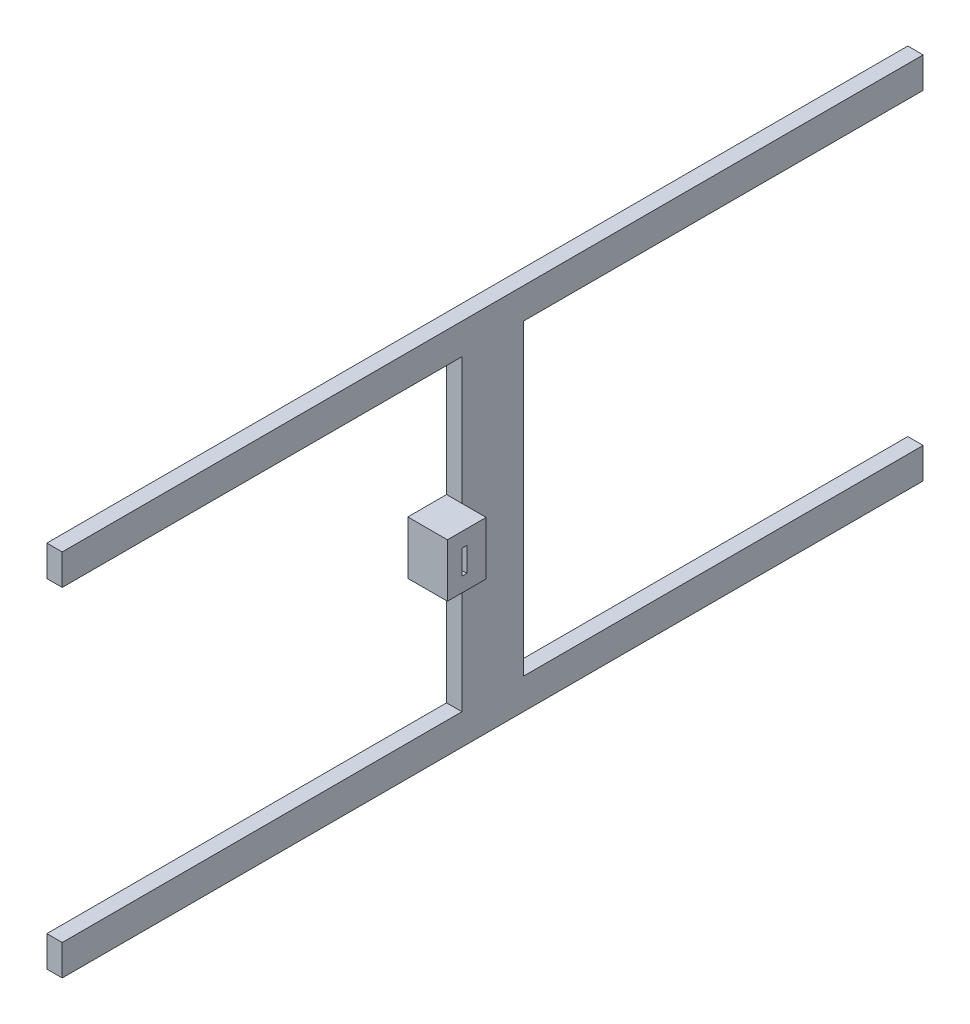
ISO-10303-21;
HEADER;
FILE_DESCRIPTION(('STEP AP214'),'2;1');
FILE_NAME('part.step','',(''),(''),'','','');
FILE_SCHEMA(('AUTOMOTIVE_DESIGN { 1 0 10303 214 1 1 1 1 }'));
ENDSEC;
DATA;
#1=APPLICATION_CONTEXT('core data for automotive mechanical design processes');
#2=APPLICATION_PROTOCOL_DEFINITION('international standard','automotive_design',2000,#1);
#3=PRODUCT_CONTEXT('',#1,'mechanical');
#4=PRODUCT('Part','Part','',(#3));
#5=PRODUCT_RELATED_PRODUCT_CATEGORY('part','',(#4));
#6=PRODUCT_DEFINITION_FORMATION('','',#4);
#7=PRODUCT_DEFINITION_CONTEXT('part definition',#1,'design');
#8=PRODUCT_DEFINITION('design','',#6,#7);
#9=PRODUCT_DEFINITION_SHAPE('','',#8);
#10=(LENGTH_UNIT() NAMED_UNIT(*) SI_UNIT(.MILLI.,.METRE.));
#11=(NAMED_UNIT(*) PLANE_ANGLE_UNIT() SI_UNIT($,.RADIAN.));
#12=(NAMED_UNIT(*) SI_UNIT($,.STERADIAN.) SOLID_ANGLE_UNIT());
#13=UNCERTAINTY_MEASURE_WITH_UNIT(LENGTH_MEASURE(1.E-05),#10,'distance_accuracy_value','');
#14=(GEOMETRIC_REPRESENTATION_CONTEXT(3) GLOBAL_UNCERTAINTY_ASSIGNED_CONTEXT((#13)) GLOBAL_UNIT_ASSIGNED_CONTEXT((#10,
#11,#12)) REPRESENTATION_CONTEXT('',''));
#15=CARTESIAN_POINT('',(0.,0.,0.));
#16=DIRECTION('',(0.,0.,1.));
#17=DIRECTION('',(1.,0.,0.));
#18=AXIS2_PLACEMENT_3D('',#15,#16,#17);
#19=CARTESIAN_POINT('',(3.175,0.,-19.7322265129906));
#20=DIRECTION('',(0.,0.,1.));
#21=DIRECTION('',(1.,0.,0.));
#22=AXIS2_PLACEMENT_3D('',#19,#20,#21);
#23=PLANE('',#22);
#24=DIRECTION('',(0.,1.,0.));
#25=VECTOR('',#24,1.);
#26=CARTESIAN_POINT('',(3.175,0.,-19.7322265129906));
#27=LINE('',#26,#25);
#28=CARTESIAN_POINT('',(3.175,-31.75,-19.7322265129906));
#29=VERTEX_POINT('',#28);
#30=CARTESIAN_POINT('',(3.175,-5.5,-19.7322265129906));
#31=VERTEX_POINT('',#30);
#32=EDGE_CURVE('E308',#29,#31,#27,.T.);
#33=ORIENTED_EDGE('',*,*,#32,.T.);
#34=DIRECTION('',(-1.,0.,0.));
#35=VECTOR('',#34,1.);
#36=CARTESIAN_POINT('',(5.,-5.5,-19.7322265129906));
#37=LINE('',#36,#35);
#38=CARTESIAN_POINT('',(0.,-5.5,-19.7322265129906));
#39=VERTEX_POINT('',#38);
#40=EDGE_CURVE('E265',#31,#39,#37,.T.);
#41=ORIENTED_EDGE('',*,*,#40,.T.);
#42=DIRECTION('',(0.,1.,0.));
#43=VECTOR('',#42,1.);
#44=CARTESIAN_POINT('',(0.,0.,-19.7322265129906));
#45=LINE('',#44,#43);
#46=CARTESIAN_POINT('',(0.,-31.75,-19.7322265129906));
#47=VERTEX_POINT('',#46);
#48=EDGE_CURVE('E342',#47,#39,#45,.T.);
#49=ORIENTED_EDGE('',*,*,#48,.F.);
#50=DIRECTION('',(-1.,0.,0.));
#51=VECTOR('',#50,1.);
#52=CARTESIAN_POINT('',(3.175,-31.75,-19.7322265129906));
#53=LINE('',#52,#51);
#54=EDGE_CURVE('E369',#29,#47,#53,.T.);
#55=ORIENTED_EDGE('',*,*,#54,.F.);
#56=EDGE_LOOP('',(#33,#41,#49,#55));
#57=FACE_BOUND('',#56,.T.);
#58=ADVANCED_FACE('F35',(#57),#23,.T.);
#59=CARTESIAN_POINT('',(0.,5.5,-19.7322265129906));
#60=VERTEX_POINT('',#59);
#61=CARTESIAN_POINT('',(0.,31.75,-19.7322265129906));
#62=VERTEX_POINT('',#61);
#63=EDGE_CURVE('E341',#60,#62,#45,.T.);
#64=ORIENTED_EDGE('',*,*,#63,.F.);
#65=DIRECTION('',(-1.,0.,0.));
#66=VECTOR('',#65,1.);
#67=CARTESIAN_POINT('',(5.,5.5,-19.7322265129906));
#68=LINE('',#67,#66);
#69=CARTESIAN_POINT('',(3.175,5.5,-19.7322265129906));
#70=VERTEX_POINT('',#69);
#71=EDGE_CURVE('E280',#70,#60,#68,.T.);
#72=ORIENTED_EDGE('',*,*,#71,.F.);
#73=CARTESIAN_POINT('',(3.175,31.75,-19.7322265129906));
#74=VERTEX_POINT('',#73);
#75=EDGE_CURVE('E307',#70,#74,#27,.T.);
#76=ORIENTED_EDGE('',*,*,#75,.T.);
#77=DIRECTION('',(-1.,0.,0.));
#78=VECTOR('',#77,1.);
#79=CARTESIAN_POINT('',(3.175,31.75,-19.7322265129906));
#80=LINE('',#79,#78);
#81=EDGE_CURVE('E371',#74,#62,#80,.T.);
#82=ORIENTED_EDGE('',*,*,#81,.T.);
#83=EDGE_LOOP('',(#64,#72,#76,#82));
#84=FACE_BOUND('',#83,.T.);
#85=ADVANCED_FACE('F453',(#84),#23,.T.);
#86=CARTESIAN_POINT('',(3.175,0.,-32.4322265129906));
#87=DIRECTION('',(0.,0.,-1.));
#88=DIRECTION('',(-1.,0.,0.));
#89=AXIS2_PLACEMENT_3D('',#86,#87,#88);
#90=PLANE('',#89);
#91=DIRECTION('',(0.,-1.,0.));
#92=VECTOR('',#91,1.);
#93=CARTESIAN_POINT('',(0.,0.,-32.4322265129906));
#94=LINE('',#93,#92);
#95=CARTESIAN_POINT('',(0.,31.75,-32.4322265129906));
#96=VERTEX_POINT('',#95);
#97=CARTESIAN_POINT('',(0.,-31.75,-32.4322265129906));
#98=VERTEX_POINT('',#97);
#99=EDGE_CURVE('E291',#96,#98,#94,.T.);
#100=ORIENTED_EDGE('',*,*,#99,.F.);
#101=DIRECTION('',(-1.,0.,0.));
#102=VECTOR('',#101,1.);
#103=CARTESIAN_POINT('',(3.175,31.75,-32.4322265129906));
#104=LINE('',#103,#102);
#105=CARTESIAN_POINT('',(3.175,31.75,-32.4322265129906));
#106=VERTEX_POINT('',#105);
#107=EDGE_CURVE('E11',#106,#96,#104,.T.);
#108=ORIENTED_EDGE('',*,*,#107,.F.);
#109=DIRECTION('',(0.,-1.,0.));
#110=VECTOR('',#109,1.);
#111=CARTESIAN_POINT('',(3.175,0.,-32.4322265129906));
#112=LINE('',#111,#110);
#113=CARTESIAN_POINT('',(3.175,-31.75,-32.4322265129906));
#114=VERTEX_POINT('',#113);
#115=EDGE_CURVE('E292',#106,#114,#112,.T.);
#116=ORIENTED_EDGE('',*,*,#115,.T.);
#117=DIRECTION('',(-1.,0.,0.));
#118=VECTOR('',#117,1.);
#119=CARTESIAN_POINT('',(3.175,-31.75,-32.4322265129906));
#120=LINE('',#119,#118);
#121=EDGE_CURVE('E327',#114,#98,#120,.T.);
#122=ORIENTED_EDGE('',*,*,#121,.T.);
#123=EDGE_LOOP('',(#100,#108,#116,#122));
#124=FACE_BOUND('',#123,.T.);
#125=ADVANCED_FACE('F37',(#124),#90,.T.);
#126=CARTESIAN_POINT('',(3.175,31.75,0.));
#127=DIRECTION('',(0.,1.,0.));
#128=DIRECTION('',(0.,0.,1.));
#129=AXIS2_PLACEMENT_3D('',#126,#127,#128);
#130=PLANE('',#129);
#131=DIRECTION('',(0.,0.,-1.));
#132=VECTOR('',#131,1.);
#133=CARTESIAN_POINT('',(0.,31.75,0.));
#134=LINE('',#133,#132);
#135=CARTESIAN_POINT('',(0.,31.75,-114.982226512991));
#136=VERTEX_POINT('',#135);
#137=EDGE_CURVE('E330',#96,#136,#134,.T.);
#138=ORIENTED_EDGE('',*,*,#137,.T.);
#139=DIRECTION('',(-1.,0.,0.));
#140=VECTOR('',#139,1.);
#141=CARTESIAN_POINT('',(3.175,31.75,-114.982226512991));
#142=LINE('',#141,#140);
#143=CARTESIAN_POINT('',(3.175,31.75,-114.982226512991));
#144=VERTEX_POINT('',#143);
#145=EDGE_CURVE('E43',#144,#136,#142,.T.);
#146=ORIENTED_EDGE('',*,*,#145,.F.);
#147=DIRECTION('',(0.,0.,-1.));
#148=VECTOR('',#147,1.);
#149=CARTESIAN_POINT('',(3.175,31.75,0.));
#150=LINE('',#149,#148);
#151=EDGE_CURVE('E295',#106,#144,#150,.T.);
#152=ORIENTED_EDGE('',*,*,#151,.F.);
#153=ORIENTED_EDGE('',*,*,#107,.T.);
#154=EDGE_LOOP('',(#138,#146,#152,#153));
#155=FACE_BOUND('',#154,.T.);
#156=ADVANCED_FACE('F412',(#155),#130,.F.);
#157=CARTESIAN_POINT('',(3.175,0.,-114.982226512991));
#158=DIRECTION('',(0.,0.,1.));
#159=DIRECTION('',(1.,0.,0.));
#160=AXIS2_PLACEMENT_3D('',#157,#158,#159);
#161=PLANE('',#160);
#162=DIRECTION('',(0.,1.,0.));
#163=VECTOR('',#162,1.);
#164=CARTESIAN_POINT('',(0.,0.,-114.982226512991));
#165=LINE('',#164,#163);
#166=CARTESIAN_POINT('',(0.,38.1,-114.982226512991));
#167=VERTEX_POINT('',#166);
#168=EDGE_CURVE('E332',#136,#167,#165,.T.);
#169=ORIENTED_EDGE('',*,*,#168,.T.);
#170=DIRECTION('',(-1.,0.,0.));
#171=VECTOR('',#170,1.);
#172=CARTESIAN_POINT('',(3.175,38.1,-114.982226512991));
#173=LINE('',#172,#171);
#174=CARTESIAN_POINT('',(3.175,38.1,-114.982226512991));
#175=VERTEX_POINT('',#174);
#176=EDGE_CURVE('E380',#175,#167,#173,.T.);
#177=ORIENTED_EDGE('',*,*,#176,.F.);
#178=DIRECTION('',(0.,1.,0.));
#179=VECTOR('',#178,1.);
#180=CARTESIAN_POINT('',(3.175,0.,-114.982226512991));
#181=LINE('',#180,#179);
#182=EDGE_CURVE('E298',#144,#175,#181,.T.);
#183=ORIENTED_EDGE('',*,*,#182,.F.);
#184=ORIENTED_EDGE('',*,*,#145,.T.);
#185=EDGE_LOOP('',(#169,#177,#183,#184));
#186=FACE_BOUND('',#185,.T.);
#187=ADVANCED_FACE('F387',(#186),#161,.F.);
#188=CARTESIAN_POINT('',(3.175,38.1,0.));
#189=DIRECTION('',(0.,-1.,0.));
#190=DIRECTION('',(0.,0.,-1.));
#191=AXIS2_PLACEMENT_3D('',#188,#189,#190);
#192=PLANE('',#191);
#193=DIRECTION('',(0.,0.,1.));
#194=VECTOR('',#193,1.);
#195=CARTESIAN_POINT('',(0.,38.1,0.));
#196=LINE('',#195,#194);
#197=CARTESIAN_POINT('',(0.,38.1,62.8177734870094));
#198=VERTEX_POINT('',#197);
#199=EDGE_CURVE('E334',#167,#198,#196,.T.);
#200=ORIENTED_EDGE('',*,*,#199,.T.);
#201=DIRECTION('',(-1.,0.,0.));
#202=VECTOR('',#201,1.);
#203=CARTESIAN_POINT('',(3.175,38.1,62.8177734870094));
#204=LINE('',#203,#202);
#205=CARTESIAN_POINT('',(3.175,38.1,62.8177734870094));
#206=VERTEX_POINT('',#205);
#207=EDGE_CURVE('E377',#206,#198,#204,.T.);
#208=ORIENTED_EDGE('',*,*,#207,.F.);
#209=DIRECTION('',(0.,0.,1.));
#210=VECTOR('',#209,1.);
#211=CARTESIAN_POINT('',(3.175,38.1,0.));
#212=LINE('',#211,#210);
#213=EDGE_CURVE('E300',#175,#206,#212,.T.);
#214=ORIENTED_EDGE('',*,*,#213,.F.);
#215=ORIENTED_EDGE('',*,*,#176,.T.);
#216=EDGE_LOOP('',(#200,#208,#214,#215));
#217=FACE_BOUND('',#216,.T.);
#218=ADVANCED_FACE('F399',(#217),#192,.F.);
#219=CARTESIAN_POINT('',(3.175,0.,62.8177734870094));
#220=DIRECTION('',(0.,0.,-1.));
#221=DIRECTION('',(-1.,0.,0.));
#222=AXIS2_PLACEMENT_3D('',#219,#220,#221);
#223=PLANE('',#222);
#224=DIRECTION('',(0.,-1.,0.));
#225=VECTOR('',#224,1.);
#226=CARTESIAN_POINT('',(0.,0.,62.8177734870094));
#227=LINE('',#226,#225);
#228=CARTESIAN_POINT('',(0.,31.75,62.8177734870094));
#229=VERTEX_POINT('',#228);
#230=EDGE_CURVE('E336',#198,#229,#227,.T.);
#231=ORIENTED_EDGE('',*,*,#230,.T.);
#232=DIRECTION('',(-1.,0.,0.));
#233=VECTOR('',#232,1.);
#234=CARTESIAN_POINT('',(3.175,31.75,62.8177734870094));
#235=LINE('',#234,#233);
#236=CARTESIAN_POINT('',(3.175,31.75,62.8177734870094));
#237=VERTEX_POINT('',#236);
#238=EDGE_CURVE('E374',#237,#229,#235,.T.);
#239=ORIENTED_EDGE('',*,*,#238,.F.);
#240=DIRECTION('',(0.,-1.,0.));
#241=VECTOR('',#240,1.);
#242=CARTESIAN_POINT('',(3.175,0.,62.8177734870094));
#243=LINE('',#242,#241);
#244=EDGE_CURVE('E302',#206,#237,#243,.T.);
#245=ORIENTED_EDGE('',*,*,#244,.F.);
#246=ORIENTED_EDGE('',*,*,#207,.T.);
#247=EDGE_LOOP('',(#231,#239,#245,#246));
#248=FACE_BOUND('',#247,.T.);
#249=ADVANCED_FACE('F403',(#248),#223,.F.);
#250=CARTESIAN_POINT('',(3.175,31.75,0.));
#251=DIRECTION('',(0.,1.,0.));
#252=DIRECTION('',(0.,0.,1.));
#253=AXIS2_PLACEMENT_3D('',#250,#251,#252);
#254=PLANE('',#253);
#255=DIRECTION('',(0.,0.,-1.));
#256=VECTOR('',#255,1.);
#257=CARTESIAN_POINT('',(0.,31.75,0.));
#258=LINE('',#257,#256);
#259=EDGE_CURVE('E338',#229,#62,#258,.T.);
#260=ORIENTED_EDGE('',*,*,#259,.T.);
#261=ORIENTED_EDGE('',*,*,#81,.F.);
#262=DIRECTION('',(0.,0.,-1.));
#263=VECTOR('',#262,1.);
#264=CARTESIAN_POINT('',(3.175,31.75,0.));
#265=LINE('',#264,#263);
#266=EDGE_CURVE('E304',#237,#74,#265,.T.);
#267=ORIENTED_EDGE('',*,*,#266,.F.);
#268=ORIENTED_EDGE('',*,*,#238,.T.);
#269=EDGE_LOOP('',(#260,#261,#267,#268));
#270=FACE_BOUND('',#269,.T.);
#271=ADVANCED_FACE('F480',(#270),#254,.F.);
#272=DIRECTION('',(-1.,0.,0.));
#273=VECTOR('',#272,1.);
#274=CARTESIAN_POINT('',(5.,-2.5,-19.7322265129906));
#275=LINE('',#274,#273);
#276=CARTESIAN_POINT('',(3.175,-2.5,-19.7322265129906));
#277=VERTEX_POINT('',#276);
#278=CARTESIAN_POINT('',(0.,-2.5,-19.7322265129906));
#279=VERTEX_POINT('',#278);
#280=EDGE_CURVE('E269',#277,#279,#275,.T.);
#281=ORIENTED_EDGE('',*,*,#280,.F.);
#282=CARTESIAN_POINT('',(3.175,2.5,-19.7322265129906));
#283=VERTEX_POINT('',#282);
#284=EDGE_CURVE('E312',#277,#283,#27,.T.);
#285=ORIENTED_EDGE('',*,*,#284,.T.);
#286=DIRECTION('',(-1.,0.,0.));
#287=VECTOR('',#286,1.);
#288=CARTESIAN_POINT('',(5.,2.5,-19.7322265129906));
#289=LINE('',#288,#287);
#290=CARTESIAN_POINT('',(0.,2.5,-19.7322265129906));
#291=VERTEX_POINT('',#290);
#292=EDGE_CURVE('E276',#283,#291,#289,.T.);
#293=ORIENTED_EDGE('',*,*,#292,.T.);
#294=EDGE_CURVE('E346',#279,#291,#45,.T.);
#295=ORIENTED_EDGE('',*,*,#294,.F.);
#296=EDGE_LOOP('',(#281,#285,#293,#295));
#297=FACE_BOUND('',#296,.T.);
#298=ADVANCED_FACE('F472',(#297),#23,.T.);
#299=CARTESIAN_POINT('',(3.175,-31.75,0.));
#300=DIRECTION('',(0.,1.,0.));
#301=DIRECTION('',(0.,0.,1.));
#302=AXIS2_PLACEMENT_3D('',#299,#300,#301);
#303=PLANE('',#302);
#304=DIRECTION('',(0.,0.,-1.));
#305=VECTOR('',#304,1.);
#306=CARTESIAN_POINT('',(0.,-31.75,0.));
#307=LINE('',#306,#305);
#308=CARTESIAN_POINT('',(0.,-31.75,62.8177734870094));
#309=VERTEX_POINT('',#308);
#310=EDGE_CURVE('E345',#309,#47,#307,.T.);
#311=ORIENTED_EDGE('',*,*,#310,.F.);
#312=DIRECTION('',(-1.,0.,0.));
#313=VECTOR('',#312,1.);
#314=CARTESIAN_POINT('',(3.175,-31.75,62.8177734870094));
#315=LINE('',#314,#313);
#316=CARTESIAN_POINT('',(3.175,-31.75,62.8177734870094));
#317=VERTEX_POINT('',#316);
#318=EDGE_CURVE('E367',#317,#309,#315,.T.);
#319=ORIENTED_EDGE('',*,*,#318,.F.);
#320=DIRECTION('',(0.,0.,-1.));
#321=VECTOR('',#320,1.);
#322=CARTESIAN_POINT('',(3.175,-31.75,0.));
#323=LINE('',#322,#321);
#324=EDGE_CURVE('E311',#317,#29,#323,.T.);
#325=ORIENTED_EDGE('',*,*,#324,.T.);
#326=ORIENTED_EDGE('',*,*,#54,.T.);
#327=EDGE_LOOP('',(#311,#319,#325,#326));
#328=FACE_BOUND('',#327,.T.);
#329=ADVANCED_FACE('F432',(#328),#303,.T.);
#330=CARTESIAN_POINT('',(3.175,0.,62.8177734870094));
#331=DIRECTION('',(0.,0.,1.));
#332=DIRECTION('',(1.,0.,0.));
#333=AXIS2_PLACEMENT_3D('',#330,#331,#332);
#334=PLANE('',#333);
#335=DIRECTION('',(0.,1.,0.));
#336=VECTOR('',#335,1.);
#337=CARTESIAN_POINT('',(0.,0.,62.8177734870094));
#338=LINE('',#337,#336);
#339=CARTESIAN_POINT('',(0.,-38.1,62.8177734870094));
#340=VERTEX_POINT('',#339);
#341=EDGE_CURVE('E349',#340,#309,#338,.T.);
#342=ORIENTED_EDGE('',*,*,#341,.F.);
#343=DIRECTION('',(-1.,0.,0.));
#344=VECTOR('',#343,1.);
#345=CARTESIAN_POINT('',(3.175,-38.1,62.8177734870094));
#346=LINE('',#345,#344);
#347=CARTESIAN_POINT('',(3.175,-38.1,62.8177734870094));
#348=VERTEX_POINT('',#347);
#349=EDGE_CURVE('E365',#348,#340,#346,.T.);
#350=ORIENTED_EDGE('',*,*,#349,.F.);
#351=DIRECTION('',(0.,1.,0.));
#352=VECTOR('',#351,1.);
#353=CARTESIAN_POINT('',(3.175,0.,62.8177734870094));
#354=LINE('',#353,#352);
#355=EDGE_CURVE('E315',#348,#317,#354,.T.);
#356=ORIENTED_EDGE('',*,*,#355,.T.);
#357=ORIENTED_EDGE('',*,*,#318,.T.);
#358=EDGE_LOOP('',(#342,#350,#356,#357));
#359=FACE_BOUND('',#358,.T.);
#360=ADVANCED_FACE('F428',(#359),#334,.T.);
#361=CARTESIAN_POINT('',(3.175,-38.1,0.));
#362=DIRECTION('',(0.,-1.,0.));
#363=DIRECTION('',(0.,0.,-1.));
#364=AXIS2_PLACEMENT_3D('',#361,#362,#363);
#365=PLANE('',#364);
#366=DIRECTION('',(0.,0.,1.));
#367=VECTOR('',#366,1.);
#368=CARTESIAN_POINT('',(0.,-38.1,0.));
#369=LINE('',#368,#367);
#370=CARTESIAN_POINT('',(0.,-38.1,-114.982226512991));
#371=VERTEX_POINT('',#370);
#372=EDGE_CURVE('E352',#371,#340,#369,.T.);
#373=ORIENTED_EDGE('',*,*,#372,.F.);
#374=DIRECTION('',(-1.,0.,0.));
#375=VECTOR('',#374,1.);
#376=CARTESIAN_POINT('',(3.175,-38.1,-114.982226512991));
#377=LINE('',#376,#375);
#378=CARTESIAN_POINT('',(3.175,-38.1,-114.982226512991));
#379=VERTEX_POINT('',#378);
#380=EDGE_CURVE('E363',#379,#371,#377,.T.);
#381=ORIENTED_EDGE('',*,*,#380,.F.);
#382=DIRECTION('',(0.,0.,1.));
#383=VECTOR('',#382,1.);
#384=CARTESIAN_POINT('',(3.175,-38.1,0.));
#385=LINE('',#384,#383);
#386=EDGE_CURVE('E318',#379,#348,#385,.T.);
#387=ORIENTED_EDGE('',*,*,#386,.T.);
#388=ORIENTED_EDGE('',*,*,#349,.T.);
#389=EDGE_LOOP('',(#373,#381,#387,#388));
#390=FACE_BOUND('',#389,.T.);
#391=ADVANCED_FACE('F424',(#390),#365,.T.);
#392=CARTESIAN_POINT('',(3.175,0.,-114.982226512991));
#393=DIRECTION('',(0.,0.,-1.));
#394=DIRECTION('',(-1.,0.,0.));
#395=AXIS2_PLACEMENT_3D('',#392,#393,#394);
#396=PLANE('',#395);
#397=DIRECTION('',(0.,-1.,0.));
#398=VECTOR('',#397,1.);
#399=CARTESIAN_POINT('',(0.,0.,-114.982226512991));
#400=LINE('',#399,#398);
#401=CARTESIAN_POINT('',(0.,-31.75,-114.982226512991));
#402=VERTEX_POINT('',#401);
#403=EDGE_CURVE('E355',#402,#371,#400,.T.);
#404=ORIENTED_EDGE('',*,*,#403,.F.);
#405=DIRECTION('',(-1.,0.,0.));
#406=VECTOR('',#405,1.);
#407=CARTESIAN_POINT('',(3.175,-31.75,-114.982226512991));
#408=LINE('',#407,#406);
#409=CARTESIAN_POINT('',(3.175,-31.75,-114.982226512991));
#410=VERTEX_POINT('',#409);
#411=EDGE_CURVE('E361',#410,#402,#408,.T.);
#412=ORIENTED_EDGE('',*,*,#411,.F.);
#413=DIRECTION('',(0.,-1.,0.));
#414=VECTOR('',#413,1.);
#415=CARTESIAN_POINT('',(3.175,0.,-114.982226512991));
#416=LINE('',#415,#414);
#417=EDGE_CURVE('E321',#410,#379,#416,.T.);
#418=ORIENTED_EDGE('',*,*,#417,.T.);
#419=ORIENTED_EDGE('',*,*,#380,.T.);
#420=EDGE_LOOP('',(#404,#412,#418,#419));
#421=FACE_BOUND('',#420,.T.);
#422=ADVANCED_FACE('F420',(#421),#396,.T.);
#423=CARTESIAN_POINT('',(3.175,-31.75,0.));
#424=DIRECTION('',(0.,1.,0.));
#425=DIRECTION('',(0.,0.,1.));
#426=AXIS2_PLACEMENT_3D('',#423,#424,#425);
#427=PLANE('',#426);
#428=DIRECTION('',(0.,0.,-1.));
#429=VECTOR('',#428,1.);
#430=CARTESIAN_POINT('',(0.,-31.75,0.));
#431=LINE('',#430,#429);
#432=EDGE_CURVE('E296',#98,#402,#431,.T.);
#433=ORIENTED_EDGE('',*,*,#432,.F.);
#434=ORIENTED_EDGE('',*,*,#121,.F.);
#435=DIRECTION('',(0.,0.,-1.));
#436=VECTOR('',#435,1.);
#437=CARTESIAN_POINT('',(3.175,-31.75,0.));
#438=LINE('',#437,#436);
#439=EDGE_CURVE('E324',#114,#410,#438,.T.);
#440=ORIENTED_EDGE('',*,*,#439,.T.);
#441=ORIENTED_EDGE('',*,*,#411,.T.);
#442=EDGE_LOOP('',(#433,#434,#440,#441));
#443=FACE_BOUND('',#442,.T.);
#444=ADVANCED_FACE('F416',(#443),#427,.T.);
#445=CARTESIAN_POINT('',(3.175,0.,0.));
#446=DIRECTION('',(1.,0.,0.));
#447=DIRECTION('',(0.,0.,-1.));
#448=AXIS2_PLACEMENT_3D('',#445,#446,#447);
#449=PLANE('',#448);
#450=ORIENTED_EDGE('',*,*,#115,.F.);
#451=ORIENTED_EDGE('',*,*,#151,.T.);
#452=ORIENTED_EDGE('',*,*,#182,.T.);
#453=ORIENTED_EDGE('',*,*,#213,.T.);
#454=ORIENTED_EDGE('',*,*,#244,.T.);
#455=ORIENTED_EDGE('',*,*,#266,.T.);
#456=ORIENTED_EDGE('',*,*,#75,.F.);
#457=DIRECTION('',(0.,-1.,0.));
#458=VECTOR('',#457,1.);
#459=CARTESIAN_POINT('',(3.175,0.,-19.7322265129906));
#460=LINE('',#459,#458);
#461=EDGE_CURVE('E264',#70,#283,#460,.T.);
#462=ORIENTED_EDGE('',*,*,#461,.T.);
#463=ORIENTED_EDGE('',*,*,#284,.F.);
#464=DIRECTION('',(0.,-1.,0.));
#465=VECTOR('',#464,1.);
#466=CARTESIAN_POINT('',(3.175,0.,-19.7322265129906));
#467=LINE('',#466,#465);
#468=EDGE_CURVE('E288',#277,#31,#467,.T.);
#469=ORIENTED_EDGE('',*,*,#468,.T.);
#470=ORIENTED_EDGE('',*,*,#32,.F.);
#471=ORIENTED_EDGE('',*,*,#324,.F.);
#472=ORIENTED_EDGE('',*,*,#355,.F.);
#473=ORIENTED_EDGE('',*,*,#386,.F.);
#474=ORIENTED_EDGE('',*,*,#417,.F.);
#475=ORIENTED_EDGE('',*,*,#439,.F.);
#476=EDGE_LOOP('',(#450,#451,#452,#453,#454,#455,#456,#462,#463,#469,#470,#471,#472,#473,#474,#475));
#477=FACE_BOUND('',#476,.T.);
#478=ADVANCED_FACE('F408',(#477),#449,.T.);
#479=CARTESIAN_POINT('',(0.,0.,0.));
#480=DIRECTION('',(1.,0.,0.));
#481=DIRECTION('',(0.,0.,-1.));
#482=AXIS2_PLACEMENT_3D('',#479,#480,#481);
#483=PLANE('',#482);
#484=DIRECTION('',(0.,0.,-1.));
#485=VECTOR('',#484,1.);
#486=CARTESIAN_POINT('',(0.,-2.5,0.));
#487=LINE('',#486,#485);
#488=CARTESIAN_POINT('',(0.,-2.5,-14.7322265129906));
#489=VERTEX_POINT('',#488);
#490=EDGE_CURVE('E58',#489,#279,#487,.T.);
#491=ORIENTED_EDGE('',*,*,#490,.T.);
#492=ORIENTED_EDGE('',*,*,#294,.T.);
#493=DIRECTION('',(0.,0.,1.));
#494=VECTOR('',#493,1.);
#495=CARTESIAN_POINT('',(0.,2.5,0.));
#496=LINE('',#495,#494);
#497=CARTESIAN_POINT('',(0.,2.5,-14.7322265129906));
#498=VERTEX_POINT('',#497);
#499=EDGE_CURVE('E255',#291,#498,#496,.T.);
#500=ORIENTED_EDGE('',*,*,#499,.T.);
#501=DIRECTION('',(0.,-1.,0.));
#502=VECTOR('',#501,1.);
#503=CARTESIAN_POINT('',(0.,0.,-14.7322265129906));
#504=LINE('',#503,#502);
#505=EDGE_CURVE('E258',#498,#489,#504,.T.);
#506=ORIENTED_EDGE('',*,*,#505,.T.);
#507=EDGE_LOOP('',(#491,#492,#500,#506));
#508=FACE_BOUND('',#507,.T.);
#509=ORIENTED_EDGE('',*,*,#99,.T.);
#510=ORIENTED_EDGE('',*,*,#432,.T.);
#511=ORIENTED_EDGE('',*,*,#403,.T.);
#512=ORIENTED_EDGE('',*,*,#372,.T.);
#513=ORIENTED_EDGE('',*,*,#341,.T.);
#514=ORIENTED_EDGE('',*,*,#310,.T.);
#515=ORIENTED_EDGE('',*,*,#48,.T.);
#516=DIRECTION('',(0.,0.,-1.));
#517=VECTOR('',#516,1.);
#518=CARTESIAN_POINT('',(0.,-5.5,0.));
#519=LINE('',#518,#517);
#520=CARTESIAN_POINT('',(0.,-5.5,-11.7322265129906));
#521=VERTEX_POINT('',#520);
#522=EDGE_CURVE('E207',#521,#39,#519,.T.);
#523=ORIENTED_EDGE('',*,*,#522,.F.);
#524=DIRECTION('',(0.,-1.,0.));
#525=VECTOR('',#524,1.);
#526=CARTESIAN_POINT('',(0.,0.,-11.7322265129906));
#527=LINE('',#526,#525);
#528=CARTESIAN_POINT('',(0.,5.5,-11.7322265129906));
#529=VERTEX_POINT('',#528);
#530=EDGE_CURVE('E252',#529,#521,#527,.T.);
#531=ORIENTED_EDGE('',*,*,#530,.F.);
#532=DIRECTION('',(0.,0.,1.));
#533=VECTOR('',#532,1.);
#534=CARTESIAN_POINT('',(0.,5.5,0.));
#535=LINE('',#534,#533);
#536=EDGE_CURVE('E50',#60,#529,#535,.T.);
#537=ORIENTED_EDGE('',*,*,#536,.F.);
#538=ORIENTED_EDGE('',*,*,#63,.T.);
#539=ORIENTED_EDGE('',*,*,#259,.F.);
#540=ORIENTED_EDGE('',*,*,#230,.F.);
#541=ORIENTED_EDGE('',*,*,#199,.F.);
#542=ORIENTED_EDGE('',*,*,#168,.F.);
#543=ORIENTED_EDGE('',*,*,#137,.F.);
#544=EDGE_LOOP('',(#509,#510,#511,#512,#513,#514,#515,#523,#531,#537,#538,#539,#540,#541,#542,#543));
#545=FACE_BOUND('',#544,.T.);
#546=ADVANCED_FACE('F393',(#508,#545),#483,.F.);
#547=CARTESIAN_POINT('',(5.,-5.5,0.));
#548=DIRECTION('',(0.,1.,0.));
#549=DIRECTION('',(0.,0.,1.));
#550=AXIS2_PLACEMENT_3D('',#547,#548,#549);
#551=PLANE('',#550);
#552=ORIENTED_EDGE('',*,*,#522,.T.);
#553=ORIENTED_EDGE('',*,*,#40,.F.);
#554=CARTESIAN_POINT('',(8.175,-5.5,-19.7322265129906));
#555=VERTEX_POINT('',#554);
#556=EDGE_CURVE('E261',#555,#31,#37,.T.);
#557=ORIENTED_EDGE('',*,*,#556,.F.);
#558=DIRECTION('',(0.,0.,-1.));
#559=VECTOR('',#558,1.);
#560=CARTESIAN_POINT('',(8.175,-5.5,0.));
#561=LINE('',#560,#559);
#562=CARTESIAN_POINT('',(8.175,-5.5,-11.7322265129906));
#563=VERTEX_POINT('',#562);
#564=EDGE_CURVE('E234',#563,#555,#561,.T.);
#565=ORIENTED_EDGE('',*,*,#564,.F.);
#566=DIRECTION('',(-1.,0.,0.));
#567=VECTOR('',#566,1.);
#568=CARTESIAN_POINT('',(5.,-5.5,-11.7322265129906));
#569=LINE('',#568,#567);
#570=EDGE_CURVE('E250',#563,#521,#569,.T.);
#571=ORIENTED_EDGE('',*,*,#570,.T.);
#572=EDGE_LOOP('',(#552,#553,#557,#565,#571));
#573=FACE_BOUND('',#572,.T.);
#574=ADVANCED_FACE('F439',(#573),#551,.F.);
#575=CARTESIAN_POINT('',(5.,0.,-19.7322265129906));
#576=DIRECTION('',(0.,0.,1.));
#577=DIRECTION('',(1.,0.,0.));
#578=AXIS2_PLACEMENT_3D('',#575,#576,#577);
#579=PLANE('',#578);
#580=ORIENTED_EDGE('',*,*,#468,.F.);
#581=CARTESIAN_POINT('',(5.,-2.5,-19.7322265129906));
#582=VERTEX_POINT('',#581);
#583=EDGE_CURVE('E266',#582,#277,#275,.T.);
#584=ORIENTED_EDGE('',*,*,#583,.F.);
#585=DIRECTION('',(0.,1.,0.));
#586=VECTOR('',#585,1.);
#587=CARTESIAN_POINT('',(5.,0.,-19.7322265129906));
#588=LINE('',#587,#586);
#589=CARTESIAN_POINT('',(5.,2.5,-19.7322265129906));
#590=VERTEX_POINT('',#589);
#591=EDGE_CURVE('E224',#582,#590,#588,.T.);
#592=ORIENTED_EDGE('',*,*,#591,.T.);
#593=EDGE_CURVE('E273',#590,#283,#289,.T.);
#594=ORIENTED_EDGE('',*,*,#593,.T.);
#595=ORIENTED_EDGE('',*,*,#461,.F.);
#596=CARTESIAN_POINT('',(8.175,5.5,-19.7322265129906));
#597=VERTEX_POINT('',#596);
#598=EDGE_CURVE('E277',#597,#70,#68,.T.);
#599=ORIENTED_EDGE('',*,*,#598,.F.);
#600=DIRECTION('',(0.,1.,0.));
#601=VECTOR('',#600,1.);
#602=CARTESIAN_POINT('',(8.175,0.,-19.7322265129906));
#603=LINE('',#602,#601);
#604=EDGE_CURVE('E237',#555,#597,#603,.T.);
#605=ORIENTED_EDGE('',*,*,#604,.F.);
#606=ORIENTED_EDGE('',*,*,#556,.T.);
#607=EDGE_LOOP('',(#580,#584,#592,#594,#595,#599,#605,#606));
#608=FACE_BOUND('',#607,.T.);
#609=ADVANCED_FACE('F443',(#608),#579,.F.);
#610=CARTESIAN_POINT('',(5.,-2.5,0.));
#611=DIRECTION('',(0.,1.,0.));
#612=DIRECTION('',(0.,0.,1.));
#613=AXIS2_PLACEMENT_3D('',#610,#611,#612);
#614=PLANE('',#613);
#615=ORIENTED_EDGE('',*,*,#490,.F.);
#616=DIRECTION('',(-1.,0.,0.));
#617=VECTOR('',#616,1.);
#618=CARTESIAN_POINT('',(5.,-2.5,-14.7322265129906));
#619=LINE('',#618,#617);
#620=CARTESIAN_POINT('',(8.175,-2.5,-14.7322265129906));
#621=VERTEX_POINT('',#620);
#622=EDGE_CURVE('E213',#621,#489,#619,.T.);
#623=ORIENTED_EDGE('',*,*,#622,.F.);
#624=DIRECTION('',(0.,0.,1.));
#625=VECTOR('',#624,1.);
#626=CARTESIAN_POINT('',(8.175,-2.5,0.));
#627=LINE('',#626,#625);
#628=CARTESIAN_POINT('',(8.175,-2.5,-15.7322265129906));
#629=VERTEX_POINT('',#628);
#630=EDGE_CURVE('E211',#629,#621,#627,.T.);
#631=ORIENTED_EDGE('',*,*,#630,.F.);
#632=DIRECTION('',(-1.,0.,0.));
#633=VECTOR('',#632,1.);
#634=CARTESIAN_POINT('',(8.175,-2.5,-15.7322265129906));
#635=LINE('',#634,#633);
#636=CARTESIAN_POINT('',(5.,-2.5,-15.7322265129906));
#637=VERTEX_POINT('',#636);
#638=EDGE_CURVE('E198',#629,#637,#635,.T.);
#639=ORIENTED_EDGE('',*,*,#638,.T.);
#640=DIRECTION('',(0.,0.,-1.));
#641=VECTOR('',#640,1.);
#642=CARTESIAN_POINT('',(5.,-2.5,0.));
#643=LINE('',#642,#641);
#644=EDGE_CURVE('E248',#637,#582,#643,.T.);
#645=ORIENTED_EDGE('',*,*,#644,.T.);
#646=ORIENTED_EDGE('',*,*,#583,.T.);
#647=ORIENTED_EDGE('',*,*,#280,.T.);
#648=EDGE_LOOP('',(#615,#623,#631,#639,#645,#646,#647));
#649=FACE_BOUND('',#648,.T.);
#650=ADVANCED_FACE('F212',(#649),#614,.T.);
#651=CARTESIAN_POINT('',(5.,0.,-14.7322265129906));
#652=DIRECTION('',(0.,0.,-1.));
#653=DIRECTION('',(-1.,0.,0.));
#654=AXIS2_PLACEMENT_3D('',#651,#652,#653);
#655=PLANE('',#654);
#656=ORIENTED_EDGE('',*,*,#505,.F.);
#657=DIRECTION('',(-1.,0.,0.));
#658=VECTOR('',#657,1.);
#659=CARTESIAN_POINT('',(5.,2.5,-14.7322265129906));
#660=LINE('',#659,#658);
#661=CARTESIAN_POINT('',(8.175,2.5,-14.7322265129906));
#662=VERTEX_POINT('',#661);
#663=EDGE_CURVE('E271',#662,#498,#660,.T.);
#664=ORIENTED_EDGE('',*,*,#663,.F.);
#665=DIRECTION('',(0.,1.,0.));
#666=VECTOR('',#665,1.);
#667=CARTESIAN_POINT('',(8.175,0.,-14.7322265129906));
#668=LINE('',#667,#666);
#669=EDGE_CURVE('E217',#621,#662,#668,.T.);
#670=ORIENTED_EDGE('',*,*,#669,.F.);
#671=ORIENTED_EDGE('',*,*,#622,.T.);
#672=EDGE_LOOP('',(#656,#664,#670,#671));
#673=FACE_BOUND('',#672,.T.);
#674=ADVANCED_FACE('F493',(#673),#655,.T.);
#675=CARTESIAN_POINT('',(5.,2.5,0.));
#676=DIRECTION('',(0.,-1.,0.));
#677=DIRECTION('',(0.,0.,-1.));
#678=AXIS2_PLACEMENT_3D('',#675,#676,#677);
#679=PLANE('',#678);
#680=ORIENTED_EDGE('',*,*,#499,.F.);
#681=ORIENTED_EDGE('',*,*,#292,.F.);
#682=ORIENTED_EDGE('',*,*,#593,.F.);
#683=DIRECTION('',(0.,0.,1.));
#684=VECTOR('',#683,1.);
#685=CARTESIAN_POINT('',(5.,2.5,0.));
#686=LINE('',#685,#684);
#687=CARTESIAN_POINT('',(5.,2.5,-15.7322265129906));
#688=VERTEX_POINT('',#687);
#689=EDGE_CURVE('E245',#590,#688,#686,.T.);
#690=ORIENTED_EDGE('',*,*,#689,.T.);
#691=DIRECTION('',(-1.,0.,0.));
#692=VECTOR('',#691,1.);
#693=CARTESIAN_POINT('',(8.175,2.5,-15.7322265129906));
#694=LINE('',#693,#692);
#695=CARTESIAN_POINT('',(8.175,2.5,-15.7322265129906));
#696=VERTEX_POINT('',#695);
#697=EDGE_CURVE('E208',#696,#688,#694,.T.);
#698=ORIENTED_EDGE('',*,*,#697,.F.);
#699=DIRECTION('',(0.,0.,-1.));
#700=VECTOR('',#699,1.);
#701=CARTESIAN_POINT('',(8.175,2.5,0.));
#702=LINE('',#701,#700);
#703=EDGE_CURVE('E222',#662,#696,#702,.T.);
#704=ORIENTED_EDGE('',*,*,#703,.F.);
#705=ORIENTED_EDGE('',*,*,#663,.T.);
#706=EDGE_LOOP('',(#680,#681,#682,#690,#698,#704,#705));
#707=FACE_BOUND('',#706,.T.);
#708=ADVANCED_FACE('F467',(#707),#679,.T.);
#709=CARTESIAN_POINT('',(5.,5.5,0.));
#710=DIRECTION('',(0.,-1.,0.));
#711=DIRECTION('',(0.,0.,-1.));
#712=AXIS2_PLACEMENT_3D('',#709,#710,#711);
#713=PLANE('',#712);
#714=ORIENTED_EDGE('',*,*,#536,.T.);
#715=DIRECTION('',(-1.,0.,0.));
#716=VECTOR('',#715,1.);
#717=CARTESIAN_POINT('',(5.,5.5,-11.7322265129906));
#718=LINE('',#717,#716);
#719=CARTESIAN_POINT('',(8.175,5.5,-11.7322265129906));
#720=VERTEX_POINT('',#719);
#721=EDGE_CURVE('E281',#720,#529,#718,.T.);
#722=ORIENTED_EDGE('',*,*,#721,.F.);
#723=DIRECTION('',(0.,0.,1.));
#724=VECTOR('',#723,1.);
#725=CARTESIAN_POINT('',(8.175,5.5,0.));
#726=LINE('',#725,#724);
#727=EDGE_CURVE('E240',#597,#720,#726,.T.);
#728=ORIENTED_EDGE('',*,*,#727,.F.);
#729=ORIENTED_EDGE('',*,*,#598,.T.);
#730=ORIENTED_EDGE('',*,*,#71,.T.);
#731=EDGE_LOOP('',(#714,#722,#728,#729,#730));
#732=FACE_BOUND('',#731,.T.);
#733=ADVANCED_FACE('F455',(#732),#713,.F.);
#734=CARTESIAN_POINT('',(5.,0.,-11.7322265129906));
#735=DIRECTION('',(0.,0.,-1.));
#736=DIRECTION('',(0.,1.,0.));
#737=AXIS2_PLACEMENT_3D('',#734,#735,#736);
#738=PLANE('',#737);
#739=ORIENTED_EDGE('',*,*,#530,.T.);
#740=ORIENTED_EDGE('',*,*,#570,.F.);
#741=DIRECTION('',(0.,-1.,0.));
#742=VECTOR('',#741,1.);
#743=CARTESIAN_POINT('',(8.175,0.,-11.7322265129906));
#744=LINE('',#743,#742);
#745=EDGE_CURVE('E231',#720,#563,#744,.T.);
#746=ORIENTED_EDGE('',*,*,#745,.F.);
#747=ORIENTED_EDGE('',*,*,#721,.T.);
#748=EDGE_LOOP('',(#739,#740,#746,#747));
#749=FACE_BOUND('',#748,.T.);
#750=ADVANCED_FACE('F459',(#749),#738,.F.);
#751=CARTESIAN_POINT('',(8.175,0.,-15.7322265129906));
#752=DIRECTION('',(0.,0.,1.));
#753=DIRECTION('',(1.,0.,0.));
#754=AXIS2_PLACEMENT_3D('',#751,#752,#753);
#755=PLANE('',#754);
#756=DIRECTION('',(0.,1.,0.));
#757=VECTOR('',#756,1.);
#758=CARTESIAN_POINT('',(5.,0.,-15.7322265129906));
#759=LINE('',#758,#757);
#760=EDGE_CURVE('E204',#637,#688,#759,.T.);
#761=ORIENTED_EDGE('',*,*,#760,.F.);
#762=ORIENTED_EDGE('',*,*,#638,.F.);
#763=DIRECTION('',(0.,1.,0.));
#764=VECTOR('',#763,1.);
#765=CARTESIAN_POINT('',(8.175,0.,-15.7322265129906));
#766=LINE('',#765,#764);
#767=EDGE_CURVE('E202',#629,#696,#766,.T.);
#768=ORIENTED_EDGE('',*,*,#767,.T.);
#769=ORIENTED_EDGE('',*,*,#697,.T.);
#770=EDGE_LOOP('',(#761,#762,#768,#769));
#771=FACE_BOUND('',#770,.T.);
#772=ADVANCED_FACE('F200',(#771),#755,.T.);
#773=CARTESIAN_POINT('',(8.175,0.,0.));
#774=DIRECTION('',(1.,0.,0.));
#775=DIRECTION('',(0.,0.,-1.));
#776=AXIS2_PLACEMENT_3D('',#773,#774,#775);
#777=PLANE('',#776);
#778=ORIENTED_EDGE('',*,*,#767,.F.);
#779=ORIENTED_EDGE('',*,*,#630,.T.);
#780=ORIENTED_EDGE('',*,*,#669,.T.);
#781=ORIENTED_EDGE('',*,*,#703,.T.);
#782=EDGE_LOOP('',(#778,#779,#780,#781));
#783=FACE_BOUND('',#782,.T.);
#784=ORIENTED_EDGE('',*,*,#745,.T.);
#785=ORIENTED_EDGE('',*,*,#564,.T.);
#786=ORIENTED_EDGE('',*,*,#604,.T.);
#787=ORIENTED_EDGE('',*,*,#727,.T.);
#788=EDGE_LOOP('',(#784,#785,#786,#787));
#789=FACE_BOUND('',#788,.T.);
#790=ADVANCED_FACE('F219',(#783,#789),#777,.T.);
#791=CARTESIAN_POINT('',(5.,0.,0.));
#792=DIRECTION('',(1.,0.,0.));
#793=DIRECTION('',(0.,0.,-1.));
#794=AXIS2_PLACEMENT_3D('',#791,#792,#793);
#795=PLANE('',#794);
#796=ORIENTED_EDGE('',*,*,#644,.F.);
#797=ORIENTED_EDGE('',*,*,#760,.T.);
#798=ORIENTED_EDGE('',*,*,#689,.F.);
#799=ORIENTED_EDGE('',*,*,#591,.F.);
#800=EDGE_LOOP('',(#796,#797,#798,#799));
#801=FACE_BOUND('',#800,.T.);
#802=ADVANCED_FACE('F494',(#801),#795,.F.);
#803=CLOSED_SHELL('',(#58,#85,#125,#156,#187,#218,#249,#271,#298,#329,#360,#391,#422,#444,#478,
#546,#574,#609,#650,#674,#708,#733,#750,#772,#790,#802));
#804=MANIFOLD_SOLID_BREP('B2',#803);
#805=ADVANCED_BREP_SHAPE_REPRESENTATION('',(#18,#804),#14);
#806=SHAPE_DEFINITION_REPRESENTATION(#9,#805);
ENDSEC;
END-ISO-10303-21;
